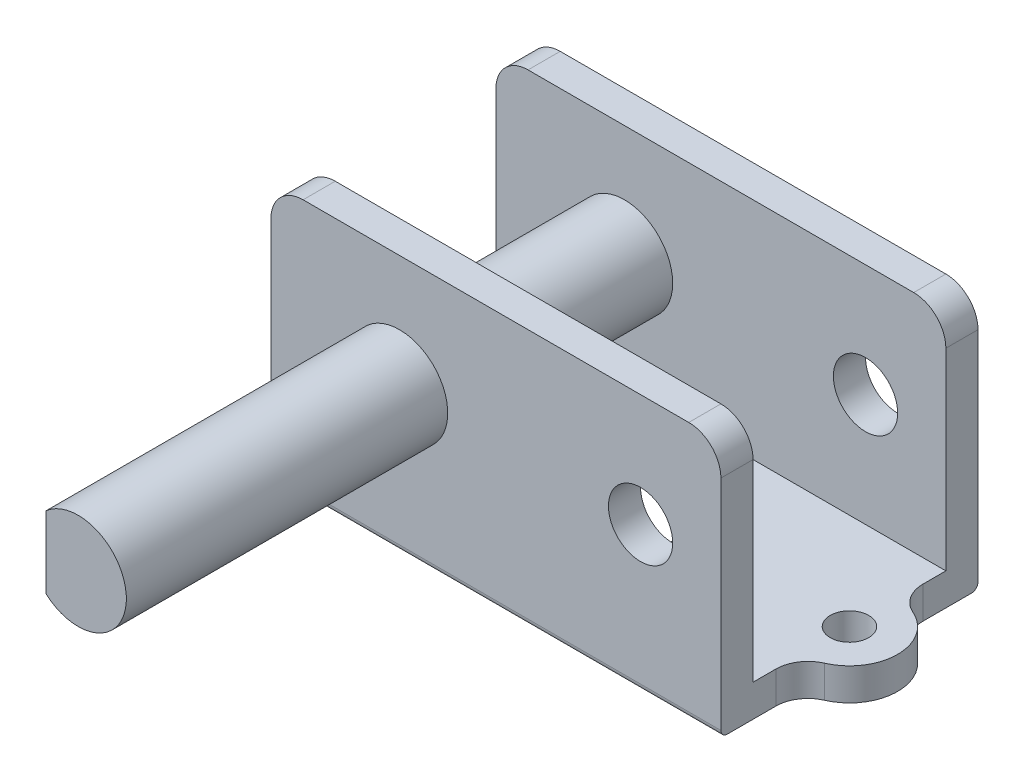
ISO-10303-21;
HEADER;
FILE_DESCRIPTION(('STEP AP214'),'2;1');
FILE_NAME('part.step','',(''),(''),'','','');
FILE_SCHEMA(('AUTOMOTIVE_DESIGN { 1 0 10303 214 1 1 1 1 }'));
ENDSEC;
DATA;
#1=APPLICATION_CONTEXT('core data for automotive mechanical design processes');
#2=APPLICATION_PROTOCOL_DEFINITION('international standard','automotive_design',2000,#1);
#3=PRODUCT_CONTEXT('',#1,'mechanical');
#4=PRODUCT('Part','Part','',(#3));
#5=PRODUCT_RELATED_PRODUCT_CATEGORY('part','',(#4));
#6=PRODUCT_DEFINITION_FORMATION('','',#4);
#7=PRODUCT_DEFINITION_CONTEXT('part definition',#1,'design');
#8=PRODUCT_DEFINITION('design','',#6,#7);
#9=PRODUCT_DEFINITION_SHAPE('','',#8);
#10=(LENGTH_UNIT() NAMED_UNIT(*) SI_UNIT(.MILLI.,.METRE.));
#11=(NAMED_UNIT(*) PLANE_ANGLE_UNIT() SI_UNIT($,.RADIAN.));
#12=(NAMED_UNIT(*) SI_UNIT($,.STERADIAN.) SOLID_ANGLE_UNIT());
#13=UNCERTAINTY_MEASURE_WITH_UNIT(LENGTH_MEASURE(1.E-05),#10,'distance_accuracy_value','');
#14=(GEOMETRIC_REPRESENTATION_CONTEXT(3) GLOBAL_UNCERTAINTY_ASSIGNED_CONTEXT((#13)) GLOBAL_UNIT_ASSIGNED_CONTEXT((#10,
#11,#12)) REPRESENTATION_CONTEXT('',''));
#15=CARTESIAN_POINT('',(0.,0.,0.));
#16=DIRECTION('',(0.,0.,1.));
#17=DIRECTION('',(1.,0.,0.));
#18=AXIS2_PLACEMENT_3D('',#15,#16,#17);
#19=CARTESIAN_POINT('',(-7.,0.,4.));
#20=DIRECTION('',(1.,0.,0.));
#21=DIRECTION('',(0.,0.,-1.));
#22=AXIS2_PLACEMENT_3D('',#19,#20,#21);
#23=PLANE('',#22);
#24=DIRECTION('',(0.,0.,1.));
#25=VECTOR('',#24,1.);
#26=CARTESIAN_POINT('',(-7.,1.,0.));
#27=LINE('',#26,#25);
#28=CARTESIAN_POINT('',(-7.,1.,2.29128784747792));
#29=VERTEX_POINT('',#28);
#30=CARTESIAN_POINT('',(-7.,1.,3.));
#31=VERTEX_POINT('',#30);
#32=EDGE_CURVE('E239',#29,#31,#27,.T.);
#33=ORIENTED_EDGE('',*,*,#32,.F.);
#34=DIRECTION('',(0.,-1.,0.));
#35=VECTOR('',#34,1.);
#36=CARTESIAN_POINT('',(-7.,0.,2.29128784747792));
#37=LINE('',#36,#35);
#38=CARTESIAN_POINT('',(-7.,0.,2.29128784747792));
#39=VERTEX_POINT('',#38);
#40=EDGE_CURVE('E370',#29,#39,#37,.T.);
#41=ORIENTED_EDGE('',*,*,#40,.T.);
#42=DIRECTION('',(0.,0.,-1.));
#43=VECTOR('',#42,1.);
#44=CARTESIAN_POINT('',(-7.,0.,4.));
#45=LINE('',#44,#43);
#46=CARTESIAN_POINT('',(-7.,0.,3.8));
#47=VERTEX_POINT('',#46);
#48=EDGE_CURVE('E282',#47,#39,#45,.T.);
#49=ORIENTED_EDGE('',*,*,#48,.F.);
#50=CARTESIAN_POINT('',(-7.,0.199999999999999,3.8));
#51=DIRECTION('',(1.,0.,0.));
#52=DIRECTION('',(0.,0.,-1.));
#53=AXIS2_PLACEMENT_3D('',#50,#51,#52);
#54=CIRCLE('',#53,0.2);
#55=CARTESIAN_POINT('',(-7.,0.199999999999999,4.));
#56=VERTEX_POINT('',#55);
#57=EDGE_CURVE('E305',#47,#56,#54,.F.);
#58=ORIENTED_EDGE('',*,*,#57,.T.);
#59=DIRECTION('',(0.,-1.,0.));
#60=VECTOR('',#59,1.);
#61=CARTESIAN_POINT('',(-7.,0.,4.));
#62=LINE('',#61,#60);
#63=CARTESIAN_POINT('',(-7.,7.,4.));
#64=VERTEX_POINT('',#63);
#65=EDGE_CURVE('E273',#64,#56,#62,.T.);
#66=ORIENTED_EDGE('',*,*,#65,.F.);
#67=DIRECTION('',(0.,0.,-1.));
#68=VECTOR('',#67,1.);
#69=CARTESIAN_POINT('',(-7.,7.,4.));
#70=LINE('',#69,#68);
#71=CARTESIAN_POINT('',(-7.,7.,3.));
#72=VERTEX_POINT('',#71);
#73=EDGE_CURVE('E344',#64,#72,#70,.T.);
#74=ORIENTED_EDGE('',*,*,#73,.T.);
#75=DIRECTION('',(0.,1.,0.));
#76=VECTOR('',#75,1.);
#77=CARTESIAN_POINT('',(-7.,0.,3.));
#78=LINE('',#77,#76);
#79=EDGE_CURVE('E236',#31,#72,#78,.T.);
#80=ORIENTED_EDGE('',*,*,#79,.F.);
#81=EDGE_LOOP('',(#33,#41,#49,#58,#66,#74,#80));
#82=FACE_BOUND('',#81,.T.);
#83=ADVANCED_FACE('F37',(#82),#23,.F.);
#84=CARTESIAN_POINT('',(7.,8.,4.));
#85=DIRECTION('',(-1.,0.,0.));
#86=DIRECTION('',(0.,-1.,0.));
#87=AXIS2_PLACEMENT_3D('',#84,#85,#86);
#88=PLANE('',#87);
#89=DIRECTION('',(0.,0.,1.));
#90=VECTOR('',#89,1.);
#91=CARTESIAN_POINT('',(7.,1.,0.));
#92=LINE('',#91,#90);
#93=CARTESIAN_POINT('',(7.,1.,-3.));
#94=VERTEX_POINT('',#93);
#95=CARTESIAN_POINT('',(7.,1.,-2.29128784747792));
#96=VERTEX_POINT('',#95);
#97=EDGE_CURVE('E230',#94,#96,#92,.T.);
#98=ORIENTED_EDGE('',*,*,#97,.T.);
#99=DIRECTION('',(0.,1.,0.));
#100=VECTOR('',#99,1.);
#101=CARTESIAN_POINT('',(7.,0.,-2.29128784747792));
#102=LINE('',#101,#100);
#103=CARTESIAN_POINT('',(7.,0.,-2.29128784747792));
#104=VERTEX_POINT('',#103);
#105=EDGE_CURVE('E359',#96,#104,#102,.F.);
#106=ORIENTED_EDGE('',*,*,#105,.T.);
#107=DIRECTION('',(0.,0.,-1.));
#108=VECTOR('',#107,1.);
#109=CARTESIAN_POINT('',(7.,0.,4.));
#110=LINE('',#109,#108);
#111=CARTESIAN_POINT('',(7.,0.,-3.8));
#112=VERTEX_POINT('',#111);
#113=EDGE_CURVE('E285',#104,#112,#110,.T.);
#114=ORIENTED_EDGE('',*,*,#113,.T.);
#115=CARTESIAN_POINT('',(7.,0.200000000000001,-3.8));
#116=DIRECTION('',(-1.,0.,0.));
#117=DIRECTION('',(0.,-1.,0.));
#118=AXIS2_PLACEMENT_3D('',#115,#116,#117);
#119=CIRCLE('',#118,0.2);
#120=CARTESIAN_POINT('',(7.,0.200000000000001,-4.));
#121=VERTEX_POINT('',#120);
#122=EDGE_CURVE('E300',#112,#121,#119,.F.);
#123=ORIENTED_EDGE('',*,*,#122,.T.);
#124=DIRECTION('',(0.,1.,0.));
#125=VECTOR('',#124,1.);
#126=CARTESIAN_POINT('',(7.,8.,-4.));
#127=LINE('',#126,#125);
#128=CARTESIAN_POINT('',(7.,7.,-4.));
#129=VERTEX_POINT('',#128);
#130=EDGE_CURVE('E265',#121,#129,#127,.T.);
#131=ORIENTED_EDGE('',*,*,#130,.T.);
#132=DIRECTION('',(0.,0.,-1.));
#133=VECTOR('',#132,1.);
#134=CARTESIAN_POINT('',(7.,7.,4.));
#135=LINE('',#134,#133);
#136=CARTESIAN_POINT('',(7.,7.,-3.));
#137=VERTEX_POINT('',#136);
#138=EDGE_CURVE('E325',#129,#137,#135,.F.);
#139=ORIENTED_EDGE('',*,*,#138,.T.);
#140=DIRECTION('',(0.,1.,0.));
#141=VECTOR('',#140,1.);
#142=CARTESIAN_POINT('',(7.,0.,-3.));
#143=LINE('',#142,#141);
#144=EDGE_CURVE('E233',#94,#137,#143,.T.);
#145=ORIENTED_EDGE('',*,*,#144,.F.);
#146=EDGE_LOOP('',(#98,#106,#114,#123,#131,#139,#145));
#147=FACE_BOUND('',#146,.T.);
#148=ADVANCED_FACE('F500',(#147),#88,.F.);
#149=CARTESIAN_POINT('',(7.,0.,3.8));
#150=VERTEX_POINT('',#149);
#151=CARTESIAN_POINT('',(7.,0.,2.29128784747792));
#152=VERTEX_POINT('',#151);
#153=EDGE_CURVE('E286',#150,#152,#110,.T.);
#154=ORIENTED_EDGE('',*,*,#153,.T.);
#155=DIRECTION('',(0.,1.,0.));
#156=VECTOR('',#155,1.);
#157=CARTESIAN_POINT('',(7.,1.,2.29128784747792));
#158=LINE('',#157,#156);
#159=CARTESIAN_POINT('',(7.,1.,2.29128784747792));
#160=VERTEX_POINT('',#159);
#161=EDGE_CURVE('E361',#152,#160,#158,.T.);
#162=ORIENTED_EDGE('',*,*,#161,.T.);
#163=CARTESIAN_POINT('',(7.,1.,3.));
#164=VERTEX_POINT('',#163);
#165=EDGE_CURVE('E229',#160,#164,#92,.T.);
#166=ORIENTED_EDGE('',*,*,#165,.T.);
#167=DIRECTION('',(0.,1.,0.));
#168=VECTOR('',#167,1.);
#169=CARTESIAN_POINT('',(7.,0.,3.));
#170=LINE('',#169,#168);
#171=CARTESIAN_POINT('',(7.,7.,3.));
#172=VERTEX_POINT('',#171);
#173=EDGE_CURVE('E226',#164,#172,#170,.T.);
#174=ORIENTED_EDGE('',*,*,#173,.T.);
#175=DIRECTION('',(0.,0.,-1.));
#176=VECTOR('',#175,1.);
#177=CARTESIAN_POINT('',(7.,7.,4.));
#178=LINE('',#177,#176);
#179=CARTESIAN_POINT('',(7.,7.,4.));
#180=VERTEX_POINT('',#179);
#181=EDGE_CURVE('E323',#172,#180,#178,.F.);
#182=ORIENTED_EDGE('',*,*,#181,.T.);
#183=DIRECTION('',(0.,1.,0.));
#184=VECTOR('',#183,1.);
#185=CARTESIAN_POINT('',(7.,8.,4.));
#186=LINE('',#185,#184);
#187=CARTESIAN_POINT('',(7.,0.200000000000001,4.));
#188=VERTEX_POINT('',#187);
#189=EDGE_CURVE('E266',#188,#180,#186,.T.);
#190=ORIENTED_EDGE('',*,*,#189,.F.);
#191=CARTESIAN_POINT('',(7.,0.200000000000001,3.8));
#192=DIRECTION('',(-1.,0.,0.));
#193=DIRECTION('',(0.,-1.,0.));
#194=AXIS2_PLACEMENT_3D('',#191,#192,#193);
#195=CIRCLE('',#194,0.2);
#196=EDGE_CURVE('E298',#188,#150,#195,.F.);
#197=ORIENTED_EDGE('',*,*,#196,.T.);
#198=EDGE_LOOP('',(#154,#162,#166,#174,#182,#190,#197));
#199=FACE_BOUND('',#198,.T.);
#200=ADVANCED_FACE('F408',(#199),#88,.F.);
#201=CARTESIAN_POINT('',(-7.,8.,4.));
#202=DIRECTION('',(0.,-1.,0.));
#203=DIRECTION('',(0.,0.,-1.));
#204=AXIS2_PLACEMENT_3D('',#201,#202,#203);
#205=PLANE('',#204);
#206=DIRECTION('',(-1.,0.,0.));
#207=VECTOR('',#206,1.);
#208=CARTESIAN_POINT('',(-7.,8.,4.));
#209=LINE('',#208,#207);
#210=CARTESIAN_POINT('',(5.99999999999999,8.,4.));
#211=VERTEX_POINT('',#210);
#212=CARTESIAN_POINT('',(-6.,8.,4.));
#213=VERTEX_POINT('',#212);
#214=EDGE_CURVE('E269',#211,#213,#209,.T.);
#215=ORIENTED_EDGE('',*,*,#214,.F.);
#216=DIRECTION('',(0.,0.,-1.));
#217=VECTOR('',#216,1.);
#218=CARTESIAN_POINT('',(6.,8.,4.));
#219=LINE('',#218,#217);
#220=CARTESIAN_POINT('',(6.,8.,3.));
#221=VERTEX_POINT('',#220);
#222=EDGE_CURVE('E333',#211,#221,#219,.T.);
#223=ORIENTED_EDGE('',*,*,#222,.T.);
#224=DIRECTION('',(1.,0.,0.));
#225=VECTOR('',#224,1.);
#226=CARTESIAN_POINT('',(-7.,8.,3.));
#227=LINE('',#226,#225);
#228=CARTESIAN_POINT('',(-6.,8.,3.));
#229=VERTEX_POINT('',#228);
#230=EDGE_CURVE('E252',#229,#221,#227,.T.);
#231=ORIENTED_EDGE('',*,*,#230,.F.);
#232=DIRECTION('',(0.,0.,-1.));
#233=VECTOR('',#232,1.);
#234=CARTESIAN_POINT('',(-6.,8.,4.));
#235=LINE('',#234,#233);
#236=EDGE_CURVE('E331',#229,#213,#235,.F.);
#237=ORIENTED_EDGE('',*,*,#236,.T.);
#238=EDGE_LOOP('',(#215,#223,#231,#237));
#239=FACE_BOUND('',#238,.T.);
#240=ADVANCED_FACE('F419',(#239),#205,.F.);
#241=CARTESIAN_POINT('',(4.5,4.5,-4.));
#242=DIRECTION('',(0.,0.,1.));
#243=DIRECTION('',(1.,0.,0.));
#244=AXIS2_PLACEMENT_3D('',#241,#242,#243);
#245=CYLINDRICAL_SURFACE('',#244,1.);
#246=CARTESIAN_POINT('',(4.5,4.5,4.));
#247=DIRECTION('',(0.,0.,1.));
#248=DIRECTION('',(1.,0.,0.));
#249=AXIS2_PLACEMENT_3D('',#246,#247,#248);
#250=CIRCLE('',#249,1.);
#251=CARTESIAN_POINT('',(5.5,4.5,4.));
#252=VERTEX_POINT('',#251);
#253=EDGE_CURVE('E259',#252,#252,#250,.T.);
#254=ORIENTED_EDGE('',*,*,#253,.T.);
#255=EDGE_LOOP('',(#254));
#256=FACE_BOUND('',#255,.T.);
#257=CARTESIAN_POINT('',(4.5,4.5,3.));
#258=DIRECTION('',(0.,0.,-1.));
#259=DIRECTION('',(-1.,0.,0.));
#260=AXIS2_PLACEMENT_3D('',#257,#258,#259);
#261=CIRCLE('',#260,1.);
#262=CARTESIAN_POINT('',(3.5,4.5,3.));
#263=VERTEX_POINT('',#262);
#264=EDGE_CURVE('E249',#263,#263,#261,.F.);
#265=ORIENTED_EDGE('',*,*,#264,.F.);
#266=EDGE_LOOP('',(#265));
#267=FACE_BOUND('',#266,.T.);
#268=ADVANCED_FACE('F514',(#256,#267),#245,.F.);
#269=DIRECTION('',(1.,0.,0.));
#270=VECTOR('',#269,1.);
#271=CARTESIAN_POINT('',(-7.,8.,-3.));
#272=LINE('',#271,#270);
#273=CARTESIAN_POINT('',(-6.,8.,-3.));
#274=VERTEX_POINT('',#273);
#275=CARTESIAN_POINT('',(6.,8.,-3.));
#276=VERTEX_POINT('',#275);
#277=EDGE_CURVE('E256',#274,#276,#272,.T.);
#278=ORIENTED_EDGE('',*,*,#277,.T.);
#279=DIRECTION('',(0.,0.,-1.));
#280=VECTOR('',#279,1.);
#281=CARTESIAN_POINT('',(6.,8.,4.));
#282=LINE('',#281,#280);
#283=CARTESIAN_POINT('',(5.99999999999999,8.,-4.));
#284=VERTEX_POINT('',#283);
#285=EDGE_CURVE('E316',#276,#284,#282,.T.);
#286=ORIENTED_EDGE('',*,*,#285,.T.);
#287=DIRECTION('',(-1.,0.,0.));
#288=VECTOR('',#287,1.);
#289=CARTESIAN_POINT('',(-7.,8.,-4.));
#290=LINE('',#289,#288);
#291=CARTESIAN_POINT('',(-6.,8.,-4.));
#292=VERTEX_POINT('',#291);
#293=EDGE_CURVE('E278',#284,#292,#290,.T.);
#294=ORIENTED_EDGE('',*,*,#293,.T.);
#295=DIRECTION('',(0.,0.,-1.));
#296=VECTOR('',#295,1.);
#297=CARTESIAN_POINT('',(-6.,8.,4.));
#298=LINE('',#297,#296);
#299=EDGE_CURVE('E314',#292,#274,#298,.F.);
#300=ORIENTED_EDGE('',*,*,#299,.T.);
#301=EDGE_LOOP('',(#278,#286,#294,#300));
#302=FACE_BOUND('',#301,.T.);
#303=ADVANCED_FACE('F509',(#302),#205,.F.);
#304=CARTESIAN_POINT('',(-7.,0.,-2.29128784747792));
#305=VERTEX_POINT('',#304);
#306=CARTESIAN_POINT('',(-7.,0.,-3.8));
#307=VERTEX_POINT('',#306);
#308=EDGE_CURVE('E275',#305,#307,#45,.T.);
#309=ORIENTED_EDGE('',*,*,#308,.F.);
#310=DIRECTION('',(0.,-1.,0.));
#311=VECTOR('',#310,1.);
#312=CARTESIAN_POINT('',(-7.,0.,-2.29128784747792));
#313=LINE('',#312,#311);
#314=CARTESIAN_POINT('',(-7.,1.,-2.29128784747792));
#315=VERTEX_POINT('',#314);
#316=EDGE_CURVE('E363',#305,#315,#313,.F.);
#317=ORIENTED_EDGE('',*,*,#316,.T.);
#318=CARTESIAN_POINT('',(-7.,1.,-3.));
#319=VERTEX_POINT('',#318);
#320=EDGE_CURVE('E240',#319,#315,#27,.T.);
#321=ORIENTED_EDGE('',*,*,#320,.F.);
#322=DIRECTION('',(0.,1.,0.));
#323=VECTOR('',#322,1.);
#324=CARTESIAN_POINT('',(-7.,0.,-3.));
#325=LINE('',#324,#323);
#326=CARTESIAN_POINT('',(-7.,7.,-3.));
#327=VERTEX_POINT('',#326);
#328=EDGE_CURVE('E243',#319,#327,#325,.T.);
#329=ORIENTED_EDGE('',*,*,#328,.T.);
#330=DIRECTION('',(0.,0.,-1.));
#331=VECTOR('',#330,1.);
#332=CARTESIAN_POINT('',(-7.,7.,4.));
#333=LINE('',#332,#331);
#334=CARTESIAN_POINT('',(-7.,7.,-4.));
#335=VERTEX_POINT('',#334);
#336=EDGE_CURVE('E347',#327,#335,#333,.T.);
#337=ORIENTED_EDGE('',*,*,#336,.T.);
#338=DIRECTION('',(0.,-1.,0.));
#339=VECTOR('',#338,1.);
#340=CARTESIAN_POINT('',(-7.,0.,-4.));
#341=LINE('',#340,#339);
#342=CARTESIAN_POINT('',(-7.,0.199999999999999,-4.));
#343=VERTEX_POINT('',#342);
#344=EDGE_CURVE('E270',#335,#343,#341,.T.);
#345=ORIENTED_EDGE('',*,*,#344,.T.);
#346=CARTESIAN_POINT('',(-7.,0.199999999999999,-3.8));
#347=DIRECTION('',(1.,0.,0.));
#348=DIRECTION('',(0.,0.,-1.));
#349=AXIS2_PLACEMENT_3D('',#346,#347,#348);
#350=CIRCLE('',#349,0.2);
#351=EDGE_CURVE('E308',#343,#307,#350,.F.);
#352=ORIENTED_EDGE('',*,*,#351,.T.);
#353=EDGE_LOOP('',(#309,#317,#321,#329,#337,#345,#352));
#354=FACE_BOUND('',#353,.T.);
#355=ADVANCED_FACE('F479',(#354),#23,.F.);
#356=CARTESIAN_POINT('',(0.,0.,4.));
#357=DIRECTION('',(0.,1.,0.));
#358=DIRECTION('',(-1.,0.,0.));
#359=AXIS2_PLACEMENT_3D('',#356,#357,#358);
#360=PLANE('',#359);
#361=CARTESIAN_POINT('',(0.,0.,0.));
#362=DIRECTION('',(0.,-1.,0.));
#363=DIRECTION('',(1.,0.,0.));
#364=AXIS2_PLACEMENT_3D('',#361,#362,#363);
#365=CIRCLE('',#364,2.);
#366=CARTESIAN_POINT('',(2.,0.,0.));
#367=VERTEX_POINT('',#366);
#368=EDGE_CURVE('E463',#367,#367,#365,.T.);
#369=ORIENTED_EDGE('',*,*,#368,.F.);
#370=EDGE_LOOP('',(#369));
#371=FACE_BOUND('',#370,.T.);
#372=CARTESIAN_POINT('',(-7.,0.,0.));
#373=DIRECTION('',(0.,-1.,0.));
#374=DIRECTION('',(1.,0.,0.));
#375=AXIS2_PLACEMENT_3D('',#372,#373,#374);
#376=CIRCLE('',#375,0.6);
#377=CARTESIAN_POINT('',(-6.4,0.,0.));
#378=VERTEX_POINT('',#377);
#379=EDGE_CURVE('E458',#378,#378,#376,.T.);
#380=ORIENTED_EDGE('',*,*,#379,.F.);
#381=EDGE_LOOP('',(#380));
#382=FACE_BOUND('',#381,.T.);
#383=CARTESIAN_POINT('',(7.,0.,0.));
#384=DIRECTION('',(0.,-1.,0.));
#385=DIRECTION('',(1.,0.,0.));
#386=AXIS2_PLACEMENT_3D('',#383,#384,#385);
#387=CIRCLE('',#386,0.6);
#388=CARTESIAN_POINT('',(7.6,0.,0.));
#389=VERTEX_POINT('',#388);
#390=EDGE_CURVE('E451',#389,#389,#387,.T.);
#391=ORIENTED_EDGE('',*,*,#390,.F.);
#392=EDGE_LOOP('',(#391));
#393=FACE_BOUND('',#392,.T.);
#394=ORIENTED_EDGE('',*,*,#48,.T.);
#395=CARTESIAN_POINT('',(-8.,0.,2.29128784747792));
#396=DIRECTION('',(0.,1.,0.));
#397=DIRECTION('',(-1.,0.,0.));
#398=AXIS2_PLACEMENT_3D('',#395,#396,#397);
#399=CIRCLE('',#398,1.);
#400=CARTESIAN_POINT('',(-7.6,0.,1.37477270848675));
#401=VERTEX_POINT('',#400);
#402=EDGE_CURVE('E45',#39,#401,#399,.T.);
#403=ORIENTED_EDGE('',*,*,#402,.T.);
#404=CARTESIAN_POINT('',(-7.,0.,0.));
#405=DIRECTION('',(0.,-1.,0.));
#406=DIRECTION('',(1.,0.,0.));
#407=AXIS2_PLACEMENT_3D('',#404,#405,#406);
#408=CIRCLE('',#407,1.5);
#409=CARTESIAN_POINT('',(-7.6,0.,-1.37477270848675));
#410=VERTEX_POINT('',#409);
#411=EDGE_CURVE('E387',#401,#410,#408,.T.);
#412=ORIENTED_EDGE('',*,*,#411,.T.);
#413=CARTESIAN_POINT('',(-8.,0.,-2.29128784747792));
#414=DIRECTION('',(0.,1.,0.));
#415=DIRECTION('',(-1.,0.,0.));
#416=AXIS2_PLACEMENT_3D('',#413,#414,#415);
#417=CIRCLE('',#416,1.);
#418=EDGE_CURVE('E382',#410,#305,#417,.T.);
#419=ORIENTED_EDGE('',*,*,#418,.T.);
#420=ORIENTED_EDGE('',*,*,#308,.T.);
#421=DIRECTION('',(1.,0.,0.));
#422=VECTOR('',#421,1.);
#423=CARTESIAN_POINT('',(7.,0.,-3.8));
#424=LINE('',#423,#422);
#425=EDGE_CURVE('E295',#307,#112,#424,.T.);
#426=ORIENTED_EDGE('',*,*,#425,.T.);
#427=ORIENTED_EDGE('',*,*,#113,.F.);
#428=CARTESIAN_POINT('',(8.,0.,-2.29128784747792));
#429=DIRECTION('',(0.,1.,0.));
#430=DIRECTION('',(-1.,0.,0.));
#431=AXIS2_PLACEMENT_3D('',#428,#429,#430);
#432=CIRCLE('',#431,1.);
#433=CARTESIAN_POINT('',(7.6,0.,-1.37477270848675));
#434=VERTEX_POINT('',#433);
#435=EDGE_CURVE('E374',#104,#434,#432,.T.);
#436=ORIENTED_EDGE('',*,*,#435,.T.);
#437=CARTESIAN_POINT('',(7.,0.,0.));
#438=DIRECTION('',(0.,-1.,0.));
#439=DIRECTION('',(1.,0.,0.));
#440=AXIS2_PLACEMENT_3D('',#437,#438,#439);
#441=CIRCLE('',#440,1.5);
#442=CARTESIAN_POINT('',(7.6,0.,1.37477270848675));
#443=VERTEX_POINT('',#442);
#444=EDGE_CURVE('E434',#443,#434,#441,.F.);
#445=ORIENTED_EDGE('',*,*,#444,.F.);
#446=CARTESIAN_POINT('',(8.,0.,2.29128784747792));
#447=DIRECTION('',(0.,1.,0.));
#448=DIRECTION('',(-1.,0.,0.));
#449=AXIS2_PLACEMENT_3D('',#446,#447,#448);
#450=CIRCLE('',#449,1.);
#451=EDGE_CURVE('E376',#443,#152,#450,.T.);
#452=ORIENTED_EDGE('',*,*,#451,.T.);
#453=ORIENTED_EDGE('',*,*,#153,.F.);
#454=DIRECTION('',(1.,0.,0.));
#455=VECTOR('',#454,1.);
#456=CARTESIAN_POINT('',(0.,0.,3.8));
#457=LINE('',#456,#455);
#458=EDGE_CURVE('E289',#150,#47,#457,.F.);
#459=ORIENTED_EDGE('',*,*,#458,.T.);
#460=EDGE_LOOP('',(#394,#403,#412,#419,#420,#426,#427,#436,#445,#452,#453,#459));
#461=FACE_BOUND('',#460,.T.);
#462=ADVANCED_FACE('F386',(#371,#382,#393,#461),#360,.F.);
#463=CARTESIAN_POINT('',(0.,0.,4.));
#464=DIRECTION('',(0.,0.,-1.));
#465=DIRECTION('',(-1.,0.,0.));
#466=AXIS2_PLACEMENT_3D('',#463,#464,#465);
#467=PLANE('',#466);
#468=CARTESIAN_POINT('',(-3.,4.5,4.));
#469=DIRECTION('',(0.,0.,-1.));
#470=DIRECTION('',(-1.,0.,0.));
#471=AXIS2_PLACEMENT_3D('',#468,#469,#470);
#472=CIRCLE('',#471,1.5);
#473=CARTESIAN_POINT('',(-4.5,4.5,4.));
#474=VERTEX_POINT('',#473);
#475=EDGE_CURVE('E220',#474,#474,#472,.T.);
#476=ORIENTED_EDGE('',*,*,#475,.T.);
#477=EDGE_LOOP('',(#476));
#478=FACE_BOUND('',#477,.T.);
#479=ORIENTED_EDGE('',*,*,#253,.F.);
#480=EDGE_LOOP('',(#479));
#481=FACE_BOUND('',#480,.T.);
#482=ORIENTED_EDGE('',*,*,#189,.T.);
#483=CARTESIAN_POINT('',(6.,7.,4.));
#484=DIRECTION('',(0.,0.,-1.));
#485=DIRECTION('',(-1.,0.,0.));
#486=AXIS2_PLACEMENT_3D('',#483,#484,#485);
#487=CIRCLE('',#486,1.);
#488=EDGE_CURVE('E342',#180,#211,#487,.F.);
#489=ORIENTED_EDGE('',*,*,#488,.T.);
#490=ORIENTED_EDGE('',*,*,#214,.T.);
#491=CARTESIAN_POINT('',(-6.,7.,4.));
#492=DIRECTION('',(0.,0.,-1.));
#493=DIRECTION('',(-1.,0.,0.));
#494=AXIS2_PLACEMENT_3D('',#491,#492,#493);
#495=CIRCLE('',#494,1.);
#496=EDGE_CURVE('E340',#213,#64,#495,.F.);
#497=ORIENTED_EDGE('',*,*,#496,.T.);
#498=ORIENTED_EDGE('',*,*,#65,.T.);
#499=DIRECTION('',(1.,0.,0.));
#500=VECTOR('',#499,1.);
#501=CARTESIAN_POINT('',(0.,0.2,4.));
#502=LINE('',#501,#500);
#503=EDGE_CURVE('E311',#56,#188,#502,.T.);
#504=ORIENTED_EDGE('',*,*,#503,.T.);
#505=EDGE_LOOP('',(#482,#489,#490,#497,#498,#504));
#506=FACE_BOUND('',#505,.T.);
#507=ADVANCED_FACE('F416',(#478,#481,#506),#467,.F.);
#508=CARTESIAN_POINT('',(0.,0.,-4.));
#509=DIRECTION('',(0.,0.,-1.));
#510=DIRECTION('',(-1.,0.,0.));
#511=AXIS2_PLACEMENT_3D('',#508,#509,#510);
#512=PLANE('',#511);
#513=CARTESIAN_POINT('',(4.5,4.5,-4.));
#514=DIRECTION('',(0.,0.,1.));
#515=DIRECTION('',(1.,0.,0.));
#516=AXIS2_PLACEMENT_3D('',#513,#514,#515);
#517=CIRCLE('',#516,1.);
#518=CARTESIAN_POINT('',(5.5,4.5,-4.));
#519=VERTEX_POINT('',#518);
#520=EDGE_CURVE('E262',#519,#519,#517,.T.);
#521=ORIENTED_EDGE('',*,*,#520,.T.);
#522=EDGE_LOOP('',(#521));
#523=FACE_BOUND('',#522,.T.);
#524=ORIENTED_EDGE('',*,*,#293,.F.);
#525=CARTESIAN_POINT('',(6.,7.,-4.));
#526=DIRECTION('',(0.,0.,-1.));
#527=DIRECTION('',(-1.,0.,0.));
#528=AXIS2_PLACEMENT_3D('',#525,#526,#527);
#529=CIRCLE('',#528,1.);
#530=EDGE_CURVE('E321',#284,#129,#529,.T.);
#531=ORIENTED_EDGE('',*,*,#530,.T.);
#532=ORIENTED_EDGE('',*,*,#130,.F.);
#533=DIRECTION('',(1.,0.,0.));
#534=VECTOR('',#533,1.);
#535=CARTESIAN_POINT('',(-7.,0.199999999999999,-4.));
#536=LINE('',#535,#534);
#537=EDGE_CURVE('E302',#121,#343,#536,.F.);
#538=ORIENTED_EDGE('',*,*,#537,.T.);
#539=ORIENTED_EDGE('',*,*,#344,.F.);
#540=CARTESIAN_POINT('',(-6.,7.,-4.));
#541=DIRECTION('',(0.,0.,-1.));
#542=DIRECTION('',(-1.,0.,0.));
#543=AXIS2_PLACEMENT_3D('',#540,#541,#542);
#544=CIRCLE('',#543,1.);
#545=EDGE_CURVE('E319',#335,#292,#544,.T.);
#546=ORIENTED_EDGE('',*,*,#545,.T.);
#547=EDGE_LOOP('',(#524,#531,#532,#538,#539,#546));
#548=FACE_BOUND('',#547,.T.);
#549=ADVANCED_FACE('F534',(#523,#548),#512,.T.);
#550=CARTESIAN_POINT('',(4.5,4.5,-3.));
#551=DIRECTION('',(0.,0.,-1.));
#552=DIRECTION('',(-1.,0.,0.));
#553=AXIS2_PLACEMENT_3D('',#550,#551,#552);
#554=CIRCLE('',#553,1.);
#555=CARTESIAN_POINT('',(3.5,4.5,-3.));
#556=VERTEX_POINT('',#555);
#557=EDGE_CURVE('E255',#556,#556,#554,.F.);
#558=ORIENTED_EDGE('',*,*,#557,.T.);
#559=EDGE_LOOP('',(#558));
#560=FACE_BOUND('',#559,.T.);
#561=ORIENTED_EDGE('',*,*,#520,.F.);
#562=EDGE_LOOP('',(#561));
#563=FACE_BOUND('',#562,.T.);
#564=ADVANCED_FACE('F553',(#560,#563),#245,.F.);
#565=CARTESIAN_POINT('',(-7.,0.,-3.));
#566=DIRECTION('',(0.,0.,-1.));
#567=DIRECTION('',(-1.,0.,0.));
#568=AXIS2_PLACEMENT_3D('',#565,#566,#567);
#569=PLANE('',#568);
#570=CARTESIAN_POINT('',(-3.,4.5,-3.));
#571=DIRECTION('',(0.,0.,1.));
#572=DIRECTION('',(1.,0.,0.));
#573=AXIS2_PLACEMENT_3D('',#570,#571,#572);
#574=CIRCLE('',#573,1.5);
#575=CARTESIAN_POINT('',(-1.5,4.5,-3.));
#576=VERTEX_POINT('',#575);
#577=EDGE_CURVE('E217',#576,#576,#574,.T.);
#578=ORIENTED_EDGE('',*,*,#577,.F.);
#579=EDGE_LOOP('',(#578));
#580=FACE_BOUND('',#579,.T.);
#581=ORIENTED_EDGE('',*,*,#557,.F.);
#582=EDGE_LOOP('',(#581));
#583=FACE_BOUND('',#582,.T.);
#584=ORIENTED_EDGE('',*,*,#144,.T.);
#585=CARTESIAN_POINT('',(6.,7.,-3.));
#586=DIRECTION('',(0.,0.,-1.));
#587=DIRECTION('',(-1.,0.,0.));
#588=AXIS2_PLACEMENT_3D('',#585,#586,#587);
#589=CIRCLE('',#588,1.);
#590=EDGE_CURVE('E329',#137,#276,#589,.F.);
#591=ORIENTED_EDGE('',*,*,#590,.T.);
#592=ORIENTED_EDGE('',*,*,#277,.F.);
#593=CARTESIAN_POINT('',(-6.,7.,-3.));
#594=DIRECTION('',(0.,0.,-1.));
#595=DIRECTION('',(-1.,0.,0.));
#596=AXIS2_PLACEMENT_3D('',#593,#594,#595);
#597=CIRCLE('',#596,1.);
#598=EDGE_CURVE('E327',#274,#327,#597,.F.);
#599=ORIENTED_EDGE('',*,*,#598,.T.);
#600=ORIENTED_EDGE('',*,*,#328,.F.);
#601=DIRECTION('',(1.,0.,0.));
#602=VECTOR('',#601,1.);
#603=CARTESIAN_POINT('',(-7.,1.,-3.));
#604=LINE('',#603,#602);
#605=EDGE_CURVE('E247',#319,#94,#604,.T.);
#606=ORIENTED_EDGE('',*,*,#605,.T.);
#607=EDGE_LOOP('',(#584,#591,#592,#599,#600,#606));
#608=FACE_BOUND('',#607,.T.);
#609=ADVANCED_FACE('F551',(#580,#583,#608),#569,.F.);
#610=CARTESIAN_POINT('',(-7.,0.,3.));
#611=DIRECTION('',(0.,0.,-1.));
#612=DIRECTION('',(-1.,0.,0.));
#613=AXIS2_PLACEMENT_3D('',#610,#611,#612);
#614=PLANE('',#613);
#615=CARTESIAN_POINT('',(-3.,4.5,3.));
#616=DIRECTION('',(0.,0.,-1.));
#617=DIRECTION('',(-1.,0.,0.));
#618=AXIS2_PLACEMENT_3D('',#615,#616,#617);
#619=CIRCLE('',#618,1.5);
#620=CARTESIAN_POINT('',(-4.5,4.5,3.));
#621=VERTEX_POINT('',#620);
#622=EDGE_CURVE('E208',#621,#621,#619,.T.);
#623=ORIENTED_EDGE('',*,*,#622,.F.);
#624=EDGE_LOOP('',(#623));
#625=FACE_BOUND('',#624,.T.);
#626=ORIENTED_EDGE('',*,*,#264,.T.);
#627=EDGE_LOOP('',(#626));
#628=FACE_BOUND('',#627,.T.);
#629=ORIENTED_EDGE('',*,*,#230,.T.);
#630=CARTESIAN_POINT('',(6.,7.,3.));
#631=DIRECTION('',(0.,0.,-1.));
#632=DIRECTION('',(-1.,0.,0.));
#633=AXIS2_PLACEMENT_3D('',#630,#631,#632);
#634=CIRCLE('',#633,1.);
#635=EDGE_CURVE('E338',#221,#172,#634,.T.);
#636=ORIENTED_EDGE('',*,*,#635,.T.);
#637=ORIENTED_EDGE('',*,*,#173,.F.);
#638=DIRECTION('',(1.,0.,0.));
#639=VECTOR('',#638,1.);
#640=CARTESIAN_POINT('',(-7.,1.,3.));
#641=LINE('',#640,#639);
#642=EDGE_CURVE('E246',#31,#164,#641,.T.);
#643=ORIENTED_EDGE('',*,*,#642,.F.);
#644=ORIENTED_EDGE('',*,*,#79,.T.);
#645=CARTESIAN_POINT('',(-6.,7.,3.));
#646=DIRECTION('',(0.,0.,-1.));
#647=DIRECTION('',(-1.,0.,0.));
#648=AXIS2_PLACEMENT_3D('',#645,#646,#647);
#649=CIRCLE('',#648,1.);
#650=EDGE_CURVE('E336',#72,#229,#649,.T.);
#651=ORIENTED_EDGE('',*,*,#650,.T.);
#652=EDGE_LOOP('',(#629,#636,#637,#643,#644,#651));
#653=FACE_BOUND('',#652,.T.);
#654=ADVANCED_FACE('F405',(#625,#628,#653),#614,.T.);
#655=CARTESIAN_POINT('',(-7.,1.,0.));
#656=DIRECTION('',(0.,1.,0.));
#657=DIRECTION('',(0.,0.,1.));
#658=AXIS2_PLACEMENT_3D('',#655,#656,#657);
#659=PLANE('',#658);
#660=CARTESIAN_POINT('',(0.,1.,0.));
#661=DIRECTION('',(0.,-1.,0.));
#662=DIRECTION('',(1.,0.,0.));
#663=AXIS2_PLACEMENT_3D('',#660,#661,#662);
#664=CIRCLE('',#663,2.);
#665=CARTESIAN_POINT('',(2.,1.,0.));
#666=VERTEX_POINT('',#665);
#667=EDGE_CURVE('E455',#666,#666,#664,.T.);
#668=ORIENTED_EDGE('',*,*,#667,.T.);
#669=EDGE_LOOP('',(#668));
#670=FACE_BOUND('',#669,.T.);
#671=CARTESIAN_POINT('',(-7.,0.999999999999999,0.));
#672=DIRECTION('',(0.,-1.,0.));
#673=DIRECTION('',(1.,0.,0.));
#674=AXIS2_PLACEMENT_3D('',#671,#672,#673);
#675=CIRCLE('',#674,0.6);
#676=CARTESIAN_POINT('',(-6.4,0.999999999999999,0.));
#677=VERTEX_POINT('',#676);
#678=EDGE_CURVE('E395',#677,#677,#675,.T.);
#679=ORIENTED_EDGE('',*,*,#678,.T.);
#680=EDGE_LOOP('',(#679));
#681=FACE_BOUND('',#680,.T.);
#682=CARTESIAN_POINT('',(7.,1.,0.));
#683=DIRECTION('',(0.,-1.,0.));
#684=DIRECTION('',(1.,0.,0.));
#685=AXIS2_PLACEMENT_3D('',#682,#683,#684);
#686=CIRCLE('',#685,0.6);
#687=CARTESIAN_POINT('',(7.6,1.,0.));
#688=VERTEX_POINT('',#687);
#689=EDGE_CURVE('E454',#688,#688,#686,.T.);
#690=ORIENTED_EDGE('',*,*,#689,.T.);
#691=EDGE_LOOP('',(#690));
#692=FACE_BOUND('',#691,.T.);
#693=ORIENTED_EDGE('',*,*,#320,.T.);
#694=CARTESIAN_POINT('',(-8.,1.,-2.29128784747792));
#695=DIRECTION('',(0.,1.,0.));
#696=DIRECTION('',(0.,0.,1.));
#697=AXIS2_PLACEMENT_3D('',#694,#695,#696);
#698=CIRCLE('',#697,1.);
#699=CARTESIAN_POINT('',(-7.6,0.999999999999999,-1.37477270848675));
#700=VERTEX_POINT('',#699);
#701=EDGE_CURVE('E380',#315,#700,#698,.F.);
#702=ORIENTED_EDGE('',*,*,#701,.T.);
#703=CARTESIAN_POINT('',(-7.,0.999999999999999,0.));
#704=DIRECTION('',(0.,-1.,0.));
#705=DIRECTION('',(1.,0.,0.));
#706=AXIS2_PLACEMENT_3D('',#703,#704,#705);
#707=CIRCLE('',#706,1.5);
#708=CARTESIAN_POINT('',(-7.6,0.999999999999999,1.37477270848675));
#709=VERTEX_POINT('',#708);
#710=EDGE_CURVE('E394',#709,#700,#707,.T.);
#711=ORIENTED_EDGE('',*,*,#710,.F.);
#712=CARTESIAN_POINT('',(-8.,1.,2.29128784747792));
#713=DIRECTION('',(0.,1.,0.));
#714=DIRECTION('',(0.,0.,1.));
#715=AXIS2_PLACEMENT_3D('',#712,#713,#714);
#716=CIRCLE('',#715,1.);
#717=EDGE_CURVE('E11',#709,#29,#716,.F.);
#718=ORIENTED_EDGE('',*,*,#717,.T.);
#719=ORIENTED_EDGE('',*,*,#32,.T.);
#720=ORIENTED_EDGE('',*,*,#642,.T.);
#721=ORIENTED_EDGE('',*,*,#165,.F.);
#722=CARTESIAN_POINT('',(8.,1.,2.29128784747792));
#723=DIRECTION('',(0.,1.,0.));
#724=DIRECTION('',(0.,0.,1.));
#725=AXIS2_PLACEMENT_3D('',#722,#723,#724);
#726=CIRCLE('',#725,1.);
#727=CARTESIAN_POINT('',(7.6,1.,1.37477270848675));
#728=VERTEX_POINT('',#727);
#729=EDGE_CURVE('E378',#160,#728,#726,.F.);
#730=ORIENTED_EDGE('',*,*,#729,.T.);
#731=CARTESIAN_POINT('',(7.,1.,0.));
#732=DIRECTION('',(0.,-1.,0.));
#733=DIRECTION('',(1.,0.,0.));
#734=AXIS2_PLACEMENT_3D('',#731,#732,#733);
#735=CIRCLE('',#734,1.5);
#736=CARTESIAN_POINT('',(7.6,1.,-1.37477270848675));
#737=VERTEX_POINT('',#736);
#738=EDGE_CURVE('E444',#728,#737,#735,.F.);
#739=ORIENTED_EDGE('',*,*,#738,.T.);
#740=CARTESIAN_POINT('',(8.,1.,-2.29128784747792));
#741=DIRECTION('',(0.,1.,0.));
#742=DIRECTION('',(0.,0.,1.));
#743=AXIS2_PLACEMENT_3D('',#740,#741,#742);
#744=CIRCLE('',#743,1.);
#745=EDGE_CURVE('E372',#737,#96,#744,.F.);
#746=ORIENTED_EDGE('',*,*,#745,.T.);
#747=ORIENTED_EDGE('',*,*,#97,.F.);
#748=ORIENTED_EDGE('',*,*,#605,.F.);
#749=EDGE_LOOP('',(#693,#702,#711,#718,#719,#720,#721,#730,#739,#746,#747,#748));
#750=FACE_BOUND('',#749,.T.);
#751=ADVANCED_FACE('F401',(#670,#681,#692,#750),#659,.T.);
#752=CARTESIAN_POINT('',(0.,0.2,-3.8));
#753=DIRECTION('',(-1.,0.,0.));
#754=DIRECTION('',(0.,-1.,0.));
#755=AXIS2_PLACEMENT_3D('',#752,#753,#754);
#756=CYLINDRICAL_SURFACE('',#755,0.2);
#757=ORIENTED_EDGE('',*,*,#351,.F.);
#758=ORIENTED_EDGE('',*,*,#537,.F.);
#759=ORIENTED_EDGE('',*,*,#122,.F.);
#760=ORIENTED_EDGE('',*,*,#425,.F.);
#761=EDGE_LOOP('',(#757,#758,#759,#760));
#762=FACE_BOUND('',#761,.T.);
#763=ADVANCED_FACE('F547',(#762),#756,.T.);
#764=CARTESIAN_POINT('',(0.,0.2,3.8));
#765=DIRECTION('',(1.,0.,0.));
#766=DIRECTION('',(0.,1.,0.));
#767=AXIS2_PLACEMENT_3D('',#764,#765,#766);
#768=CYLINDRICAL_SURFACE('',#767,0.2);
#769=ORIENTED_EDGE('',*,*,#57,.F.);
#770=ORIENTED_EDGE('',*,*,#458,.F.);
#771=ORIENTED_EDGE('',*,*,#196,.F.);
#772=ORIENTED_EDGE('',*,*,#503,.F.);
#773=EDGE_LOOP('',(#769,#770,#771,#772));
#774=FACE_BOUND('',#773,.T.);
#775=ADVANCED_FACE('F429',(#774),#768,.T.);
#776=CARTESIAN_POINT('',(6.,7.,4.));
#777=DIRECTION('',(0.,0.,-1.));
#778=DIRECTION('',(-1.,0.,0.));
#779=AXIS2_PLACEMENT_3D('',#776,#777,#778);
#780=CYLINDRICAL_SURFACE('',#779,1.);
#781=ORIENTED_EDGE('',*,*,#590,.F.);
#782=ORIENTED_EDGE('',*,*,#138,.F.);
#783=ORIENTED_EDGE('',*,*,#530,.F.);
#784=ORIENTED_EDGE('',*,*,#285,.F.);
#785=EDGE_LOOP('',(#781,#782,#783,#784));
#786=FACE_BOUND('',#785,.T.);
#787=ADVANCED_FACE('F539',(#786),#780,.T.);
#788=CARTESIAN_POINT('',(6.,7.,4.));
#789=DIRECTION('',(0.,0.,-1.));
#790=DIRECTION('',(-1.,0.,0.));
#791=AXIS2_PLACEMENT_3D('',#788,#789,#790);
#792=CYLINDRICAL_SURFACE('',#791,1.);
#793=ORIENTED_EDGE('',*,*,#488,.F.);
#794=ORIENTED_EDGE('',*,*,#181,.F.);
#795=ORIENTED_EDGE('',*,*,#635,.F.);
#796=ORIENTED_EDGE('',*,*,#222,.F.);
#797=EDGE_LOOP('',(#793,#794,#795,#796));
#798=FACE_BOUND('',#797,.T.);
#799=ADVANCED_FACE('F412',(#798),#792,.T.);
#800=CARTESIAN_POINT('',(-6.,7.,4.));
#801=DIRECTION('',(0.,0.,-1.));
#802=DIRECTION('',(-1.,0.,0.));
#803=AXIS2_PLACEMENT_3D('',#800,#801,#802);
#804=CYLINDRICAL_SURFACE('',#803,1.);
#805=ORIENTED_EDGE('',*,*,#598,.F.);
#806=ORIENTED_EDGE('',*,*,#299,.F.);
#807=ORIENTED_EDGE('',*,*,#545,.F.);
#808=ORIENTED_EDGE('',*,*,#336,.F.);
#809=EDGE_LOOP('',(#805,#806,#807,#808));
#810=FACE_BOUND('',#809,.T.);
#811=ADVANCED_FACE('F530',(#810),#804,.T.);
#812=CARTESIAN_POINT('',(-6.,7.,4.));
#813=DIRECTION('',(0.,0.,-1.));
#814=DIRECTION('',(-1.,0.,0.));
#815=AXIS2_PLACEMENT_3D('',#812,#813,#814);
#816=CYLINDRICAL_SURFACE('',#815,1.);
#817=ORIENTED_EDGE('',*,*,#496,.F.);
#818=ORIENTED_EDGE('',*,*,#236,.F.);
#819=ORIENTED_EDGE('',*,*,#650,.F.);
#820=ORIENTED_EDGE('',*,*,#73,.F.);
#821=EDGE_LOOP('',(#817,#818,#819,#820));
#822=FACE_BOUND('',#821,.T.);
#823=ADVANCED_FACE('F423',(#822),#816,.T.);
#824=CARTESIAN_POINT('',(-3.,4.5,-3.));
#825=DIRECTION('',(0.,0.,1.));
#826=DIRECTION('',(1.,0.,0.));
#827=AXIS2_PLACEMENT_3D('',#824,#825,#826);
#828=CYLINDRICAL_SURFACE('',#827,1.5);
#829=ORIENTED_EDGE('',*,*,#622,.T.);
#830=EDGE_LOOP('',(#829));
#831=FACE_BOUND('',#830,.T.);
#832=ORIENTED_EDGE('',*,*,#577,.T.);
#833=EDGE_LOOP('',(#832));
#834=FACE_BOUND('',#833,.T.);
#835=ADVANCED_FACE('F568',(#831,#834),#828,.T.);
#836=DIRECTION('',(0.,0.,1.));
#837=VECTOR('',#836,1.);
#838=CARTESIAN_POINT('',(-4.,5.6180339887499,-3.));
#839=LINE('',#838,#837);
#840=CARTESIAN_POINT('',(-4.,5.6180339887499,14.));
#841=VERTEX_POINT('',#840);
#842=CARTESIAN_POINT('',(-4.,5.6180339887499,5.));
#843=VERTEX_POINT('',#842);
#844=EDGE_CURVE('E200',#841,#843,#839,.F.);
#845=ORIENTED_EDGE('',*,*,#844,.F.);
#846=CARTESIAN_POINT('',(-3.,4.5,14.));
#847=DIRECTION('',(0.,0.,1.));
#848=DIRECTION('',(1.,0.,0.));
#849=AXIS2_PLACEMENT_3D('',#846,#847,#848);
#850=CIRCLE('',#849,1.5);
#851=CARTESIAN_POINT('',(-4.,3.3819660112501,14.));
#852=VERTEX_POINT('',#851);
#853=EDGE_CURVE('E214',#852,#841,#850,.T.);
#854=ORIENTED_EDGE('',*,*,#853,.F.);
#855=DIRECTION('',(0.,0.,1.));
#856=VECTOR('',#855,1.);
#857=CARTESIAN_POINT('',(-4.,3.3819660112501,-3.));
#858=LINE('',#857,#856);
#859=CARTESIAN_POINT('',(-4.,3.3819660112501,5.));
#860=VERTEX_POINT('',#859);
#861=EDGE_CURVE('E203',#860,#852,#858,.T.);
#862=ORIENTED_EDGE('',*,*,#861,.F.);
#863=CARTESIAN_POINT('',(-3.,4.5,5.));
#864=DIRECTION('',(0.,0.,1.));
#865=DIRECTION('',(1.,0.,0.));
#866=AXIS2_PLACEMENT_3D('',#863,#864,#865);
#867=CIRCLE('',#866,1.5);
#868=EDGE_CURVE('E207',#860,#843,#867,.F.);
#869=ORIENTED_EDGE('',*,*,#868,.T.);
#870=EDGE_LOOP('',(#845,#854,#862,#869));
#871=FACE_BOUND('',#870,.T.);
#872=ORIENTED_EDGE('',*,*,#475,.F.);
#873=EDGE_LOOP('',(#872));
#874=FACE_BOUND('',#873,.T.);
#875=ADVANCED_FACE('F212',(#871,#874),#828,.T.);
#876=CARTESIAN_POINT('',(0.,0.,14.));
#877=DIRECTION('',(0.,0.,1.));
#878=DIRECTION('',(1.,0.,0.));
#879=AXIS2_PLACEMENT_3D('',#876,#877,#878);
#880=PLANE('',#879);
#881=DIRECTION('',(0.,1.,0.));
#882=VECTOR('',#881,1.);
#883=CARTESIAN_POINT('',(-4.,0.,14.));
#884=LINE('',#883,#882);
#885=EDGE_CURVE('E196',#852,#841,#884,.T.);
#886=ORIENTED_EDGE('',*,*,#885,.F.);
#887=ORIENTED_EDGE('',*,*,#853,.T.);
#888=EDGE_LOOP('',(#886,#887));
#889=FACE_BOUND('',#888,.T.);
#890=ADVANCED_FACE('F216',(#889),#880,.T.);
#891=CARTESIAN_POINT('',(-4.,0.,5.));
#892=DIRECTION('',(1.,0.,0.));
#893=DIRECTION('',(0.,0.,-1.));
#894=AXIS2_PLACEMENT_3D('',#891,#892,#893);
#895=PLANE('',#894);
#896=ORIENTED_EDGE('',*,*,#844,.T.);
#897=DIRECTION('',(0.,1.,0.));
#898=VECTOR('',#897,1.);
#899=CARTESIAN_POINT('',(-4.,0.,5.));
#900=LINE('',#899,#898);
#901=EDGE_CURVE('E445',#860,#843,#900,.T.);
#902=ORIENTED_EDGE('',*,*,#901,.F.);
#903=ORIENTED_EDGE('',*,*,#861,.T.);
#904=ORIENTED_EDGE('',*,*,#885,.T.);
#905=EDGE_LOOP('',(#896,#902,#903,#904));
#906=FACE_BOUND('',#905,.T.);
#907=ADVANCED_FACE('F198',(#906),#895,.F.);
#908=CARTESIAN_POINT('',(0.,0.,5.));
#909=DIRECTION('',(0.,0.,1.));
#910=DIRECTION('',(1.,0.,0.));
#911=AXIS2_PLACEMENT_3D('',#908,#909,#910);
#912=PLANE('',#911);
#913=ORIENTED_EDGE('',*,*,#901,.T.);
#914=ORIENTED_EDGE('',*,*,#868,.F.);
#915=EDGE_LOOP('',(#913,#914));
#916=FACE_BOUND('',#915,.T.);
#917=ADVANCED_FACE('F702',(#916),#912,.T.);
#918=CARTESIAN_POINT('',(7.,1.,0.));
#919=DIRECTION('',(0.,-1.,0.));
#920=DIRECTION('',(1.,0.,0.));
#921=AXIS2_PLACEMENT_3D('',#918,#919,#920);
#922=CYLINDRICAL_SURFACE('',#921,1.5);
#923=ORIENTED_EDGE('',*,*,#444,.T.);
#924=DIRECTION('',(0.,-1.,0.));
#925=VECTOR('',#924,1.);
#926=CARTESIAN_POINT('',(7.6,1.,-1.37477270848675));
#927=LINE('',#926,#925);
#928=EDGE_CURVE('E356',#434,#737,#927,.F.);
#929=ORIENTED_EDGE('',*,*,#928,.T.);
#930=ORIENTED_EDGE('',*,*,#738,.F.);
#931=DIRECTION('',(0.,-1.,0.));
#932=VECTOR('',#931,1.);
#933=CARTESIAN_POINT('',(7.6,1.,1.37477270848675));
#934=LINE('',#933,#932);
#935=EDGE_CURVE('E353',#728,#443,#934,.T.);
#936=ORIENTED_EDGE('',*,*,#935,.T.);
#937=EDGE_LOOP('',(#923,#929,#930,#936));
#938=FACE_BOUND('',#937,.T.);
#939=ADVANCED_FACE('F441',(#938),#922,.T.);
#940=CARTESIAN_POINT('',(-7.,0.999999999999999,0.));
#941=DIRECTION('',(0.,-1.,0.));
#942=DIRECTION('',(1.,0.,0.));
#943=AXIS2_PLACEMENT_3D('',#940,#941,#942);
#944=CYLINDRICAL_SURFACE('',#943,1.5);
#945=ORIENTED_EDGE('',*,*,#710,.T.);
#946=DIRECTION('',(0.,-1.,0.));
#947=VECTOR('',#946,1.);
#948=CARTESIAN_POINT('',(-7.6,0.999999999999999,-1.37477270848675));
#949=LINE('',#948,#947);
#950=EDGE_CURVE('E368',#700,#410,#949,.T.);
#951=ORIENTED_EDGE('',*,*,#950,.T.);
#952=ORIENTED_EDGE('',*,*,#411,.F.);
#953=DIRECTION('',(0.,-1.,0.));
#954=VECTOR('',#953,1.);
#955=CARTESIAN_POINT('',(-7.6,0.999999999999999,1.37477270848675));
#956=LINE('',#955,#954);
#957=EDGE_CURVE('E366',#401,#709,#956,.F.);
#958=ORIENTED_EDGE('',*,*,#957,.T.);
#959=EDGE_LOOP('',(#945,#951,#952,#958));
#960=FACE_BOUND('',#959,.T.);
#961=ADVANCED_FACE('F392',(#960),#944,.T.);
#962=CARTESIAN_POINT('',(7.,1.,0.));
#963=DIRECTION('',(0.,-1.,0.));
#964=DIRECTION('',(1.,0.,0.));
#965=AXIS2_PLACEMENT_3D('',#962,#963,#964);
#966=CYLINDRICAL_SURFACE('',#965,0.6);
#967=ORIENTED_EDGE('',*,*,#689,.F.);
#968=EDGE_LOOP('',(#967));
#969=FACE_BOUND('',#968,.T.);
#970=ORIENTED_EDGE('',*,*,#390,.T.);
#971=EDGE_LOOP('',(#970));
#972=FACE_BOUND('',#971,.T.);
#973=ADVANCED_FACE('F485',(#969,#972),#966,.F.);
#974=CARTESIAN_POINT('',(-7.,0.999999999999999,0.));
#975=DIRECTION('',(0.,-1.,0.));
#976=DIRECTION('',(1.,0.,0.));
#977=AXIS2_PLACEMENT_3D('',#974,#975,#976);
#978=CYLINDRICAL_SURFACE('',#977,0.6);
#979=ORIENTED_EDGE('',*,*,#678,.F.);
#980=EDGE_LOOP('',(#979));
#981=FACE_BOUND('',#980,.T.);
#982=ORIENTED_EDGE('',*,*,#379,.T.);
#983=EDGE_LOOP('',(#982));
#984=FACE_BOUND('',#983,.T.);
#985=ADVANCED_FACE('F487',(#981,#984),#978,.F.);
#986=CARTESIAN_POINT('',(8.,1.,-2.29128784747792));
#987=DIRECTION('',(0.,-1.,0.));
#988=DIRECTION('',(1.,0.,0.));
#989=AXIS2_PLACEMENT_3D('',#986,#987,#988);
#990=CYLINDRICAL_SURFACE('',#989,1.);
#991=ORIENTED_EDGE('',*,*,#435,.F.);
#992=ORIENTED_EDGE('',*,*,#105,.F.);
#993=ORIENTED_EDGE('',*,*,#745,.F.);
#994=ORIENTED_EDGE('',*,*,#928,.F.);
#995=EDGE_LOOP('',(#991,#992,#993,#994));
#996=FACE_BOUND('',#995,.T.);
#997=ADVANCED_FACE('F494',(#996),#990,.F.);
#998=CARTESIAN_POINT('',(8.,1.,2.29128784747792));
#999=DIRECTION('',(0.,-1.,0.));
#1000=DIRECTION('',(1.,0.,0.));
#1001=AXIS2_PLACEMENT_3D('',#998,#999,#1000);
#1002=CYLINDRICAL_SURFACE('',#1001,1.);
#1003=ORIENTED_EDGE('',*,*,#729,.F.);
#1004=ORIENTED_EDGE('',*,*,#161,.F.);
#1005=ORIENTED_EDGE('',*,*,#451,.F.);
#1006=ORIENTED_EDGE('',*,*,#935,.F.);
#1007=EDGE_LOOP('',(#1003,#1004,#1005,#1006));
#1008=FACE_BOUND('',#1007,.T.);
#1009=ADVANCED_FACE('F438',(#1008),#1002,.F.);
#1010=CARTESIAN_POINT('',(-8.,0.999999999999999,-2.29128784747792));
#1011=DIRECTION('',(0.,-1.,0.));
#1012=DIRECTION('',(1.,0.,0.));
#1013=AXIS2_PLACEMENT_3D('',#1010,#1011,#1012);
#1014=CYLINDRICAL_SURFACE('',#1013,1.);
#1015=ORIENTED_EDGE('',*,*,#418,.F.);
#1016=ORIENTED_EDGE('',*,*,#950,.F.);
#1017=ORIENTED_EDGE('',*,*,#701,.F.);
#1018=ORIENTED_EDGE('',*,*,#316,.F.);
#1019=EDGE_LOOP('',(#1015,#1016,#1017,#1018));
#1020=FACE_BOUND('',#1019,.T.);
#1021=ADVANCED_FACE('F522',(#1020),#1014,.F.);
#1022=CARTESIAN_POINT('',(-8.,0.999999999999999,2.29128784747792));
#1023=DIRECTION('',(0.,-1.,0.));
#1024=DIRECTION('',(1.,0.,0.));
#1025=AXIS2_PLACEMENT_3D('',#1022,#1023,#1024);
#1026=CYLINDRICAL_SURFACE('',#1025,1.);
#1027=ORIENTED_EDGE('',*,*,#717,.F.);
#1028=ORIENTED_EDGE('',*,*,#957,.F.);
#1029=ORIENTED_EDGE('',*,*,#402,.F.);
#1030=ORIENTED_EDGE('',*,*,#40,.F.);
#1031=EDGE_LOOP('',(#1027,#1028,#1029,#1030));
#1032=FACE_BOUND('',#1031,.T.);
#1033=ADVANCED_FACE('F39',(#1032),#1026,.F.);
#1034=CARTESIAN_POINT('',(0.,1.,0.));
#1035=DIRECTION('',(0.,-1.,0.));
#1036=DIRECTION('',(1.,0.,0.));
#1037=AXIS2_PLACEMENT_3D('',#1034,#1035,#1036);
#1038=CYLINDRICAL_SURFACE('',#1037,2.);
#1039=ORIENTED_EDGE('',*,*,#667,.F.);
#1040=EDGE_LOOP('',(#1039));
#1041=FACE_BOUND('',#1040,.T.);
#1042=ORIENTED_EDGE('',*,*,#368,.T.);
#1043=EDGE_LOOP('',(#1042));
#1044=FACE_BOUND('',#1043,.T.);
#1045=ADVANCED_FACE('F471',(#1041,#1044),#1038,.F.);
#1046=CLOSED_SHELL('',(#83,#148,#200,#240,#268,#303,#355,#462,#507,#549,#564,#609,#654,#751,
#763,#775,#787,#799,#811,#823,#835,#875,#890,#907,#917,#939,#961,#973,#985,#997,#1009,#1021,
#1033,#1045));
#1047=MANIFOLD_SOLID_BREP('B2',#1046);
#1048=ADVANCED_BREP_SHAPE_REPRESENTATION('',(#18,#1047),#14);
#1049=SHAPE_DEFINITION_REPRESENTATION(#9,#1048);
ENDSEC;
END-ISO-10303-21;
